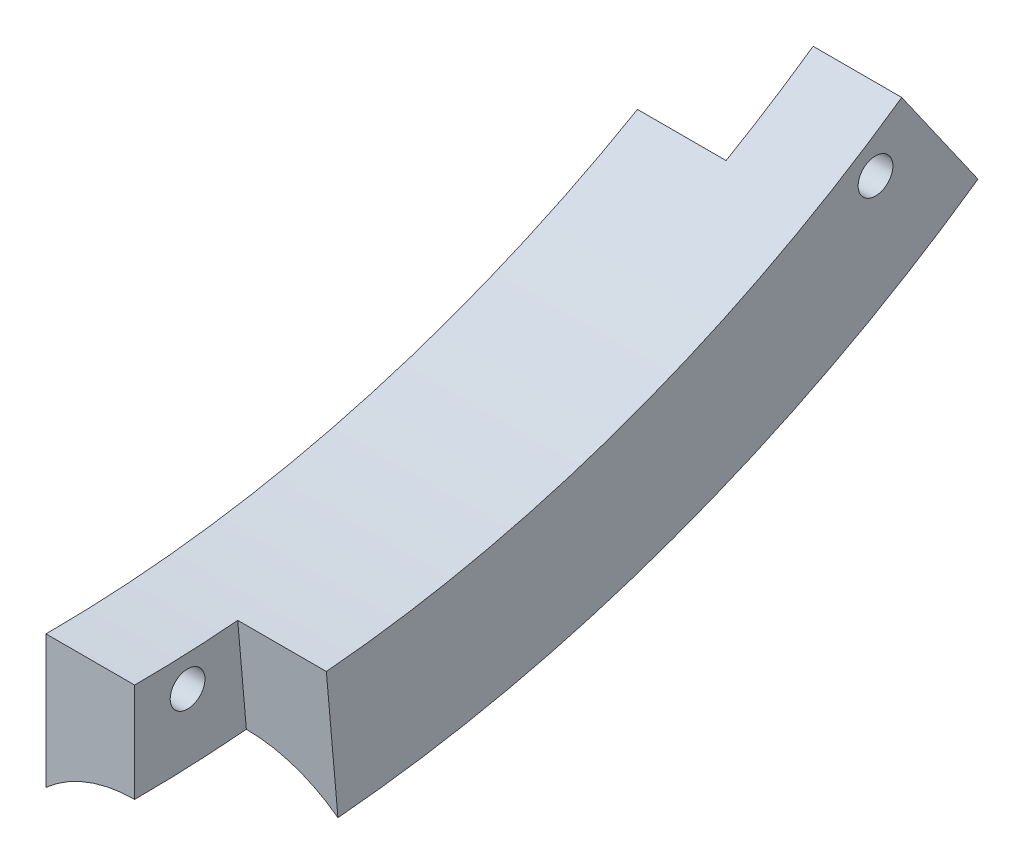
ISO-10303-21;
HEADER;
FILE_DESCRIPTION(('STEP AP214'),'2;1');
FILE_NAME('part.step','',(''),(''),'','','');
FILE_SCHEMA(('AUTOMOTIVE_DESIGN { 1 0 10303 214 1 1 1 1 }'));
ENDSEC;
DATA;
#1=APPLICATION_CONTEXT('core data for automotive mechanical design processes');
#2=APPLICATION_PROTOCOL_DEFINITION('international standard','automotive_design',2000,#1);
#3=PRODUCT_CONTEXT('',#1,'mechanical');
#4=PRODUCT('Part','Part','',(#3));
#5=PRODUCT_RELATED_PRODUCT_CATEGORY('part','',(#4));
#6=PRODUCT_DEFINITION_FORMATION('','',#4);
#7=PRODUCT_DEFINITION_CONTEXT('part definition',#1,'design');
#8=PRODUCT_DEFINITION('design','',#6,#7);
#9=PRODUCT_DEFINITION_SHAPE('','',#8);
#10=(LENGTH_UNIT() NAMED_UNIT(*) SI_UNIT(.MILLI.,.METRE.));
#11=(NAMED_UNIT(*) PLANE_ANGLE_UNIT() SI_UNIT($,.RADIAN.));
#12=(NAMED_UNIT(*) SI_UNIT($,.STERADIAN.) SOLID_ANGLE_UNIT());
#13=UNCERTAINTY_MEASURE_WITH_UNIT(LENGTH_MEASURE(1.E-05),#10,'distance_accuracy_value','');
#14=(GEOMETRIC_REPRESENTATION_CONTEXT(3) GLOBAL_UNCERTAINTY_ASSIGNED_CONTEXT((#13)) GLOBAL_UNIT_ASSIGNED_CONTEXT((#10,
#11,#12)) REPRESENTATION_CONTEXT('',''));
#15=CARTESIAN_POINT('',(0.,0.,0.));
#16=DIRECTION('',(0.,0.,1.));
#17=DIRECTION('',(1.,0.,0.));
#18=AXIS2_PLACEMENT_3D('',#15,#16,#17);
#19=CARTESIAN_POINT('',(0.,30.657273112948,-97.232448059655));
#20=DIRECTION('',(1.,0.,0.));
#21=DIRECTION('',(0.,0.,-1.));
#22=AXIS2_PLACEMENT_3D('',#19,#20,#21);
#23=PLANE('',#22);
#24=CARTESIAN_POINT('',(0.,22.7993444857398,-93.4711114462121));
#25=DIRECTION('',(1.,0.,0.));
#26=DIRECTION('',(0.,0.,-1.));
#27=AXIS2_PLACEMENT_3D('',#24,#25,#26);
#28=CIRCLE('',#27,2.4892);
#29=CARTESIAN_POINT('',(0.,22.7993444857398,-95.9603114462121));
#30=VERTEX_POINT('',#29);
#31=EDGE_CURVE('E161',#30,#30,#28,.T.);
#32=ORIENTED_EDGE('',*,*,#31,.F.);
#33=EDGE_LOOP('',(#32));
#34=FACE_BOUND('',#33,.T.);
#35=DIRECTION('',(0.,0.996194698091746,0.0871557427476516));
#36=VECTOR('',#35,1.);
#37=CARTESIAN_POINT('',(-3.70481423317415E-13,169.5196,0.));
#38=LINE('',#37,#36);
#39=CARTESIAN_POINT('',(0.,-18.3324357412814,-16.4349235476276));
#40=VERTEX_POINT('',#39);
#41=CARTESIAN_POINT('',(0.,0.64507325736643,-14.7746066482848));
#42=VERTEX_POINT('',#41);
#43=EDGE_CURVE('E124',#40,#42,#38,.T.);
#44=ORIENTED_EDGE('',*,*,#43,.F.);
#45=CARTESIAN_POINT('',(0.,169.5196,0.));
#46=DIRECTION('',(-1.,0.,0.));
#47=DIRECTION('',(0.,0.,1.));
#48=AXIS2_PLACEMENT_3D('',#45,#46,#47);
#49=CIRCLE('',#48,188.5696);
#50=CARTESIAN_POINT('',(0.,15.0524266692427,-108.159079172142));
#51=VERTEX_POINT('',#50);
#52=EDGE_CURVE('E142',#51,#40,#49,.T.);
#53=ORIENTED_EDGE('',*,*,#52,.F.);
#54=DIRECTION('',(0.,0.819152044288991,0.573576436351047));
#55=VECTOR('',#54,1.);
#56=CARTESIAN_POINT('',(0.,30.657273112948,-97.232448059655));
#57=LINE('',#56,#55);
#58=CARTESIAN_POINT('',(0.,30.657273112948,-97.232448059655));
#59=VERTEX_POINT('',#58);
#60=EDGE_CURVE('E202',#51,#59,#57,.T.);
#61=ORIENTED_EDGE('',*,*,#60,.T.);
#62=CARTESIAN_POINT('',(0.,169.5196,0.));
#63=DIRECTION('',(-1.,0.,0.));
#64=DIRECTION('',(0.,0.,1.));
#65=AXIS2_PLACEMENT_3D('',#62,#63,#64);
#66=CIRCLE('',#65,169.5196);
#67=EDGE_CURVE('E149',#59,#42,#66,.T.);
#68=ORIENTED_EDGE('',*,*,#67,.T.);
#69=EDGE_LOOP('',(#44,#53,#61,#68));
#70=FACE_BOUND('',#69,.T.);
#71=ADVANCED_FACE('F45',(#34,#70),#23,.T.);
#72=CARTESIAN_POINT('',(-12.7,169.5196,0.));
#73=DIRECTION('',(-1.,0.,0.));
#74=DIRECTION('',(0.,0.,1.));
#75=AXIS2_PLACEMENT_3D('',#72,#73,#74);
#76=TOROIDAL_SURFACE('',#75,202.768631657124,19.05);
#77=CARTESIAN_POINT('',(-12.7,-6.08318610567782,-101.384315828563));
#78=DIRECTION('',(0.,-0.500000000000007,0.866025403784434));
#79=DIRECTION('',(0.,-0.866025403784434,-0.500000000000007));
#80=AXIS2_PLACEMENT_3D('',#77,#78,#79);
#81=CIRCLE('',#80,19.05);
#82=CARTESIAN_POINT('',(-12.7,10.4145978364156,-91.8593158285631));
#83=VERTEX_POINT('',#82);
#84=CARTESIAN_POINT('',(-25.4,6.21353601853068,-94.2848000000013));
#85=VERTEX_POINT('',#84);
#86=EDGE_CURVE('E114',#83,#85,#81,.T.);
#87=ORIENTED_EDGE('',*,*,#86,.F.);
#88=CARTESIAN_POINT('',(-12.7000000000004,169.5196,0.));
#89=DIRECTION('',(-1.,0.,0.));
#90=DIRECTION('',(0.,-1.,0.));
#91=AXIS2_PLACEMENT_3D('',#88,#89,#90);
#92=CIRCLE('',#91,183.718631657124);
#93=CARTESIAN_POINT('',(-12.7,19.026107304091,-105.376678037184));
#94=VERTEX_POINT('',#93);
#95=EDGE_CURVE('E125',#94,#83,#92,.T.);
#96=ORIENTED_EDGE('',*,*,#95,.F.);
#97=CARTESIAN_POINT('',(-12.7,3.42126086038572,-116.303309149671));
#98=DIRECTION('',(0.,0.573576436351047,-0.819152044288991));
#99=DIRECTION('',(-1.,0.,0.));
#100=AXIS2_PLACEMENT_3D('',#97,#98,#99);
#101=CIRCLE('',#100,19.05);
#102=EDGE_CURVE('E210',#94,#51,#101,.T.);
#103=ORIENTED_EDGE('',*,*,#102,.T.);
#104=ORIENTED_EDGE('',*,*,#52,.T.);
#105=CARTESIAN_POINT('',(-12.7,-32.4774357961448,-17.6724506980016));
#106=DIRECTION('',(0.,0.0871557427476515,-0.996194698091746));
#107=DIRECTION('',(0.,0.996194698091746,0.0871557427476516));
#108=AXIS2_PLACEMENT_3D('',#105,#106,#107);
#109=CIRCLE('',#108,19.05);
#110=CARTESIAN_POINT('',(-12.7,-13.4999267974971,-16.0121337986588));
#111=VERTEX_POINT('',#110);
#112=EDGE_CURVE('E190',#111,#40,#109,.T.);
#113=ORIENTED_EDGE('',*,*,#112,.F.);
#114=CARTESIAN_POINT('',(-12.7000000000004,169.5196,0.));
#115=DIRECTION('',(1.,0.,0.));
#116=DIRECTION('',(0.,1.,0.));
#117=AXIS2_PLACEMENT_3D('',#114,#115,#116);
#118=CIRCLE('',#117,183.718631657124);
#119=CARTESIAN_POINT('',(-12.7,-14.1990316571237,0.));
#120=VERTEX_POINT('',#119);
#121=EDGE_CURVE('E187',#120,#111,#118,.T.);
#122=ORIENTED_EDGE('',*,*,#121,.F.);
#123=CARTESIAN_POINT('',(-12.7,-33.2490316571237,0.));
#124=DIRECTION('',(0.,0.,-1.));
#125=DIRECTION('',(-1.,0.,0.));
#126=AXIS2_PLACEMENT_3D('',#123,#124,#125);
#127=CIRCLE('',#126,19.05);
#128=CARTESIAN_POINT('',(-25.4,-19.05,0.));
#129=VERTEX_POINT('',#128);
#130=EDGE_CURVE('E140',#129,#120,#127,.T.);
#131=ORIENTED_EDGE('',*,*,#130,.F.);
#132=CARTESIAN_POINT('',(-25.4,169.5196,0.));
#133=DIRECTION('',(-1.,0.,0.));
#134=DIRECTION('',(0.,0.,1.));
#135=AXIS2_PLACEMENT_3D('',#132,#133,#134);
#136=CIRCLE('',#135,188.5696);
#137=EDGE_CURVE('E131',#85,#129,#136,.T.);
#138=ORIENTED_EDGE('',*,*,#137,.F.);
#139=EDGE_LOOP('',(#87,#96,#103,#104,#113,#122,#131,#138));
#140=FACE_BOUND('',#139,.T.);
#141=ADVANCED_FACE('F47',(#140),#76,.F.);
#142=CARTESIAN_POINT('',(-25.4,30.657273112948,-97.232448059655));
#143=DIRECTION('',(-1.,0.,0.));
#144=DIRECTION('',(0.,0.,1.));
#145=AXIS2_PLACEMENT_3D('',#142,#143,#144);
#146=PLANE('',#145);
#147=CARTESIAN_POINT('',(-25.4000000000001,-4.2794242481993,-7.58822927525577));
#148=DIRECTION('',(1.,0.,0.));
#149=DIRECTION('',(0.,0.,-1.));
#150=AXIS2_PLACEMENT_3D('',#147,#148,#149);
#151=CIRCLE('',#150,2.4892);
#152=CARTESIAN_POINT('',(-25.4000000000001,-4.2794242481993,-10.0774292752558));
#153=VERTEX_POINT('',#152);
#154=EDGE_CURVE('E171',#153,#153,#151,.T.);
#155=ORIENTED_EDGE('',*,*,#154,.T.);
#156=EDGE_LOOP('',(#155));
#157=FACE_BOUND('',#156,.T.);
#158=DIRECTION('',(0.,0.866025403784434,0.500000000000007));
#159=VECTOR('',#158,1.);
#160=CARTESIAN_POINT('',(-25.4000000000004,169.5196,0.));
#161=LINE('',#160,#159);
#162=CARTESIAN_POINT('',(-25.4,22.7113199606241,-84.7598000000012));
#163=VERTEX_POINT('',#162);
#164=EDGE_CURVE('E117',#85,#163,#161,.T.);
#165=ORIENTED_EDGE('',*,*,#164,.F.);
#166=ORIENTED_EDGE('',*,*,#137,.T.);
#167=DIRECTION('',(0.,-1.,0.));
#168=VECTOR('',#167,1.);
#169=CARTESIAN_POINT('',(-25.4,0.,0.));
#170=LINE('',#169,#168);
#171=CARTESIAN_POINT('',(-25.4,0.,0.));
#172=VERTEX_POINT('',#171);
#173=EDGE_CURVE('E197',#172,#129,#170,.T.);
#174=ORIENTED_EDGE('',*,*,#173,.F.);
#175=CARTESIAN_POINT('',(-25.4,169.5196,0.));
#176=DIRECTION('',(-1.,0.,0.));
#177=DIRECTION('',(0.,0.,1.));
#178=AXIS2_PLACEMENT_3D('',#175,#176,#177);
#179=CIRCLE('',#178,169.5196);
#180=EDGE_CURVE('E133',#163,#172,#179,.T.);
#181=ORIENTED_EDGE('',*,*,#180,.F.);
#182=EDGE_LOOP('',(#165,#166,#174,#181));
#183=FACE_BOUND('',#182,.T.);
#184=ADVANCED_FACE('F129',(#157,#183),#146,.T.);
#185=CARTESIAN_POINT('',(-25.4,169.5196,0.));
#186=DIRECTION('',(-1.,0.,0.));
#187=DIRECTION('',(0.,0.,1.));
#188=AXIS2_PLACEMENT_3D('',#185,#186,#187);
#189=CYLINDRICAL_SURFACE('',#188,169.5196);
#190=DIRECTION('',(-1.,0.,0.));
#191=VECTOR('',#190,1.);
#192=CARTESIAN_POINT('',(-25.4,22.7113199606241,-84.7598000000012));
#193=LINE('',#192,#191);
#194=CARTESIAN_POINT('',(-12.7,22.7113199606241,-84.7598000000012));
#195=VERTEX_POINT('',#194);
#196=EDGE_CURVE('E11',#163,#195,#193,.F.);
#197=ORIENTED_EDGE('',*,*,#196,.F.);
#198=ORIENTED_EDGE('',*,*,#180,.T.);
#199=DIRECTION('',(-1.,0.,0.));
#200=VECTOR('',#199,1.);
#201=CARTESIAN_POINT('',(0.,0.,0.));
#202=LINE('',#201,#200);
#203=CARTESIAN_POINT('',(-12.7,0.,0.));
#204=VERTEX_POINT('',#203);
#205=EDGE_CURVE('E193',#204,#172,#202,.T.);
#206=ORIENTED_EDGE('',*,*,#205,.F.);
#207=CARTESIAN_POINT('',(-12.7000000000004,169.5196,0.));
#208=DIRECTION('',(-1.,0.,0.));
#209=DIRECTION('',(0.,-1.,0.));
#210=AXIS2_PLACEMENT_3D('',#207,#208,#209);
#211=CIRCLE('',#210,169.5196);
#212=CARTESIAN_POINT('',(-12.7,0.64507325736643,-14.7746066482848));
#213=VERTEX_POINT('',#212);
#214=EDGE_CURVE('E71',#213,#204,#211,.T.);
#215=ORIENTED_EDGE('',*,*,#214,.F.);
#216=DIRECTION('',(-1.,0.,0.));
#217=VECTOR('',#216,1.);
#218=CARTESIAN_POINT('',(-25.4,0.645073257366457,-14.7746066482848));
#219=LINE('',#218,#217);
#220=EDGE_CURVE('E155',#42,#213,#219,.T.);
#221=ORIENTED_EDGE('',*,*,#220,.F.);
#222=ORIENTED_EDGE('',*,*,#67,.F.);
#223=DIRECTION('',(-1.,0.,0.));
#224=VECTOR('',#223,1.);
#225=CARTESIAN_POINT('',(0.,30.657273112948,-97.232448059655));
#226=LINE('',#225,#224);
#227=CARTESIAN_POINT('',(-12.7000000000001,30.657273112948,-97.232448059655));
#228=VERTEX_POINT('',#227);
#229=EDGE_CURVE('E206',#59,#228,#226,.T.);
#230=ORIENTED_EDGE('',*,*,#229,.T.);
#231=CARTESIAN_POINT('',(-12.7000000000004,169.5196,0.));
#232=DIRECTION('',(1.,0.,0.));
#233=DIRECTION('',(0.,1.,0.));
#234=AXIS2_PLACEMENT_3D('',#231,#232,#233);
#235=CIRCLE('',#234,169.5196);
#236=EDGE_CURVE('E63',#195,#228,#235,.T.);
#237=ORIENTED_EDGE('',*,*,#236,.F.);
#238=EDGE_LOOP('',(#197,#198,#206,#215,#221,#222,#230,#237));
#239=FACE_BOUND('',#238,.T.);
#240=ADVANCED_FACE('F221',(#239),#189,.F.);
#241=CARTESIAN_POINT('',(-12.7,3.42126086038572,-116.303309149671));
#242=DIRECTION('',(0.,0.573576436351047,-0.819152044288991));
#243=DIRECTION('',(-1.,0.,0.));
#244=AXIS2_PLACEMENT_3D('',#241,#242,#243);
#245=PLANE('',#244);
#246=DIRECTION('',(0.,-0.819152044288991,-0.573576436351047));
#247=VECTOR('',#246,1.);
#248=CARTESIAN_POINT('',(-12.7,3.42126086038572,-116.303309149671));
#249=LINE('',#248,#247);
#250=EDGE_CURVE('E55',#228,#94,#249,.T.);
#251=ORIENTED_EDGE('',*,*,#250,.F.);
#252=ORIENTED_EDGE('',*,*,#229,.F.);
#253=ORIENTED_EDGE('',*,*,#60,.F.);
#254=ORIENTED_EDGE('',*,*,#102,.F.);
#255=EDGE_LOOP('',(#251,#252,#253,#254));
#256=FACE_BOUND('',#255,.T.);
#257=ADVANCED_FACE('F223',(#256),#245,.T.);
#258=CARTESIAN_POINT('',(-12.7,-33.2490316571237,0.));
#259=DIRECTION('',(0.,0.,-1.));
#260=DIRECTION('',(-1.,0.,0.));
#261=AXIS2_PLACEMENT_3D('',#258,#259,#260);
#262=PLANE('',#261);
#263=ORIENTED_EDGE('',*,*,#130,.T.);
#264=DIRECTION('',(0.,1.,0.));
#265=VECTOR('',#264,1.);
#266=CARTESIAN_POINT('',(-12.6999999999999,-33.2490316571237,0.));
#267=LINE('',#266,#265);
#268=EDGE_CURVE('E147',#120,#204,#267,.T.);
#269=ORIENTED_EDGE('',*,*,#268,.T.);
#270=ORIENTED_EDGE('',*,*,#205,.T.);
#271=ORIENTED_EDGE('',*,*,#173,.T.);
#272=EDGE_LOOP('',(#263,#269,#270,#271));
#273=FACE_BOUND('',#272,.T.);
#274=ADVANCED_FACE('F233',(#273),#262,.F.);
#275=CARTESIAN_POINT('',(-12.7000000000004,169.5196,0.));
#276=DIRECTION('',(0.,0.0871557427476515,-0.996194698091746));
#277=DIRECTION('',(0.,0.996194698091746,0.0871557427476516));
#278=AXIS2_PLACEMENT_3D('',#275,#276,#277);
#279=PLANE('',#278);
#280=ORIENTED_EDGE('',*,*,#112,.T.);
#281=ORIENTED_EDGE('',*,*,#43,.T.);
#282=ORIENTED_EDGE('',*,*,#220,.T.);
#283=DIRECTION('',(0.,0.996194698091746,0.0871557427476516));
#284=VECTOR('',#283,1.);
#285=CARTESIAN_POINT('',(-12.7000000000004,169.5196,0.));
#286=LINE('',#285,#284);
#287=EDGE_CURVE('E180',#111,#213,#286,.T.);
#288=ORIENTED_EDGE('',*,*,#287,.F.);
#289=EDGE_LOOP('',(#280,#281,#282,#288));
#290=FACE_BOUND('',#289,.T.);
#291=ADVANCED_FACE('F229',(#290),#279,.F.);
#292=CARTESIAN_POINT('',(-12.7000000000004,169.5196,0.));
#293=DIRECTION('',(-1.,0.,0.));
#294=DIRECTION('',(0.,-1.,0.));
#295=AXIS2_PLACEMENT_3D('',#292,#293,#294);
#296=PLANE('',#295);
#297=CARTESIAN_POINT('',(-12.7,-4.2794242481993,-7.58822927525577));
#298=DIRECTION('',(-1.,0.,0.));
#299=DIRECTION('',(0.,-1.,0.));
#300=AXIS2_PLACEMENT_3D('',#297,#298,#299);
#301=CIRCLE('',#300,2.4892);
#302=CARTESIAN_POINT('',(-12.7,-6.76862424819929,-7.58822927525577));
#303=VERTEX_POINT('',#302);
#304=EDGE_CURVE('E49',#303,#303,#301,.T.);
#305=ORIENTED_EDGE('',*,*,#304,.T.);
#306=EDGE_LOOP('',(#305));
#307=FACE_BOUND('',#306,.T.);
#308=ORIENTED_EDGE('',*,*,#121,.T.);
#309=ORIENTED_EDGE('',*,*,#287,.T.);
#310=ORIENTED_EDGE('',*,*,#214,.T.);
#311=ORIENTED_EDGE('',*,*,#268,.F.);
#312=EDGE_LOOP('',(#308,#309,#310,#311));
#313=FACE_BOUND('',#312,.T.);
#314=ADVANCED_FACE('F230',(#307,#313),#296,.F.);
#315=CARTESIAN_POINT('',(-12.7000000000004,169.5196,0.));
#316=DIRECTION('',(0.,-0.500000000000007,0.866025403784434));
#317=DIRECTION('',(0.,-0.866025403784434,-0.500000000000007));
#318=AXIS2_PLACEMENT_3D('',#315,#316,#317);
#319=PLANE('',#318);
#320=ORIENTED_EDGE('',*,*,#86,.T.);
#321=ORIENTED_EDGE('',*,*,#164,.T.);
#322=ORIENTED_EDGE('',*,*,#196,.T.);
#323=DIRECTION('',(0.,0.866025403784434,0.500000000000007));
#324=VECTOR('',#323,1.);
#325=CARTESIAN_POINT('',(-12.7000000000004,169.5196,0.));
#326=LINE('',#325,#324);
#327=EDGE_CURVE('E119',#83,#195,#326,.T.);
#328=ORIENTED_EDGE('',*,*,#327,.F.);
#329=EDGE_LOOP('',(#320,#321,#322,#328));
#330=FACE_BOUND('',#329,.T.);
#331=ADVANCED_FACE('F116',(#330),#319,.F.);
#332=CARTESIAN_POINT('',(-12.7000000000004,169.5196,0.));
#333=DIRECTION('',(1.,0.,0.));
#334=DIRECTION('',(0.,1.,0.));
#335=AXIS2_PLACEMENT_3D('',#332,#333,#334);
#336=PLANE('',#335);
#337=CARTESIAN_POINT('',(-12.7,22.7993444857398,-93.4711114462121));
#338=DIRECTION('',(1.,0.,0.));
#339=DIRECTION('',(0.,1.,0.));
#340=AXIS2_PLACEMENT_3D('',#337,#338,#339);
#341=CIRCLE('',#340,2.4892);
#342=CARTESIAN_POINT('',(-12.7000000000001,25.2885444857397,-93.4711114462121));
#343=VERTEX_POINT('',#342);
#344=EDGE_CURVE('E135',#343,#343,#341,.T.);
#345=ORIENTED_EDGE('',*,*,#344,.T.);
#346=EDGE_LOOP('',(#345));
#347=FACE_BOUND('',#346,.T.);
#348=ORIENTED_EDGE('',*,*,#95,.T.);
#349=ORIENTED_EDGE('',*,*,#327,.T.);
#350=ORIENTED_EDGE('',*,*,#236,.T.);
#351=ORIENTED_EDGE('',*,*,#250,.T.);
#352=EDGE_LOOP('',(#348,#349,#350,#351));
#353=FACE_BOUND('',#352,.T.);
#354=ADVANCED_FACE('F225',(#347,#353),#336,.F.);
#355=CARTESIAN_POINT('',(0.,22.7993444857398,-93.4711114462121));
#356=DIRECTION('',(1.,0.,0.));
#357=DIRECTION('',(0.,0.,-1.));
#358=AXIS2_PLACEMENT_3D('',#355,#356,#357);
#359=CYLINDRICAL_SURFACE('',#358,2.4892);
#360=ORIENTED_EDGE('',*,*,#31,.T.);
#361=EDGE_LOOP('',(#360));
#362=FACE_BOUND('',#361,.T.);
#363=ORIENTED_EDGE('',*,*,#344,.F.);
#364=EDGE_LOOP('',(#363));
#365=FACE_BOUND('',#364,.T.);
#366=ADVANCED_FACE('F263',(#362,#365),#359,.F.);
#367=CARTESIAN_POINT('',(0.,-4.2794242481993,-7.58822927525577));
#368=DIRECTION('',(1.,0.,0.));
#369=DIRECTION('',(0.,0.,-1.));
#370=AXIS2_PLACEMENT_3D('',#367,#368,#369);
#371=CYLINDRICAL_SURFACE('',#370,2.4892);
#372=ORIENTED_EDGE('',*,*,#154,.F.);
#373=EDGE_LOOP('',(#372));
#374=FACE_BOUND('',#373,.T.);
#375=ORIENTED_EDGE('',*,*,#304,.F.);
#376=EDGE_LOOP('',(#375));
#377=FACE_BOUND('',#376,.T.);
#378=ADVANCED_FACE('F260',(#374,#377),#371,.F.);
#379=CLOSED_SHELL('',(#71,#141,#184,#240,#257,#274,#291,#314,#331,#354,#366,#378));
#380=MANIFOLD_SOLID_BREP('B2',#379);
#381=ADVANCED_BREP_SHAPE_REPRESENTATION('',(#18,#380),#14);
#382=SHAPE_DEFINITION_REPRESENTATION(#9,#381);
ENDSEC;
END-ISO-10303-21;
